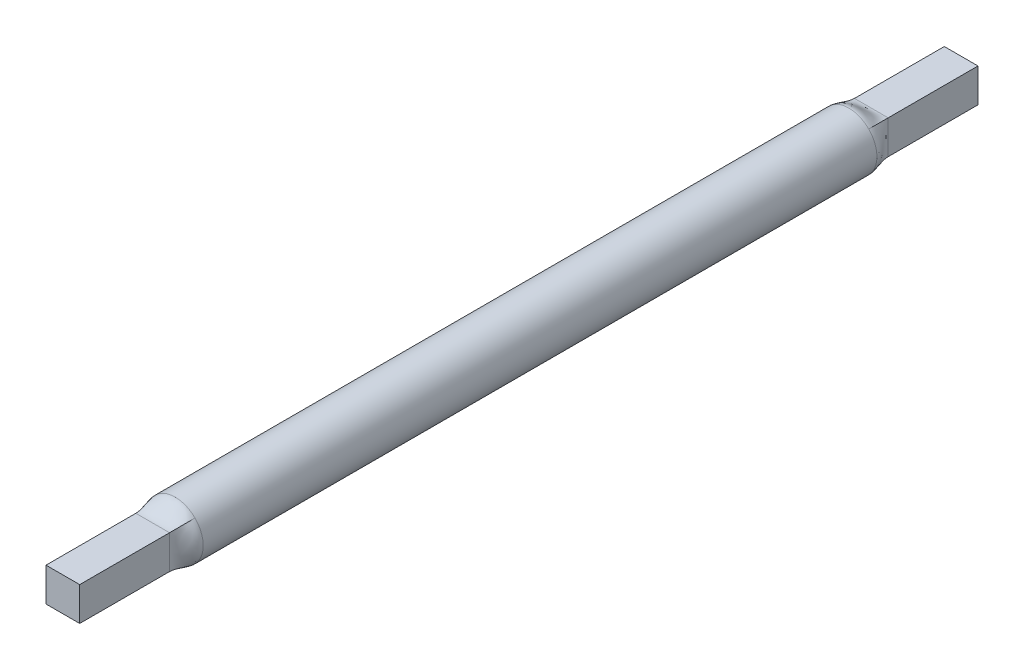
ISO-10303-21;
HEADER;
FILE_DESCRIPTION(('STEP AP214'),'2;1');
FILE_NAME('part.step','',(''),(''),'','','');
FILE_SCHEMA(('AUTOMOTIVE_DESIGN { 1 0 10303 214 1 1 1 1 }'));
ENDSEC;
DATA;
#1=APPLICATION_CONTEXT('core data for automotive mechanical design processes');
#2=APPLICATION_PROTOCOL_DEFINITION('international standard','automotive_design',2000,#1);
#3=PRODUCT_CONTEXT('',#1,'mechanical');
#4=PRODUCT('Part','Part','',(#3));
#5=PRODUCT_RELATED_PRODUCT_CATEGORY('part','',(#4));
#6=PRODUCT_DEFINITION_FORMATION('','',#4);
#7=PRODUCT_DEFINITION_CONTEXT('part definition',#1,'design');
#8=PRODUCT_DEFINITION('design','',#6,#7);
#9=PRODUCT_DEFINITION_SHAPE('','',#8);
#10=(LENGTH_UNIT() NAMED_UNIT(*) SI_UNIT(.MILLI.,.METRE.));
#11=(NAMED_UNIT(*) PLANE_ANGLE_UNIT() SI_UNIT($,.RADIAN.));
#12=(NAMED_UNIT(*) SI_UNIT($,.STERADIAN.) SOLID_ANGLE_UNIT());
#13=UNCERTAINTY_MEASURE_WITH_UNIT(LENGTH_MEASURE(1.E-05),#10,'distance_accuracy_value','');
#14=(GEOMETRIC_REPRESENTATION_CONTEXT(3) GLOBAL_UNCERTAINTY_ASSIGNED_CONTEXT((#13)) GLOBAL_UNIT_ASSIGNED_CONTEXT((#10,
#11,#12)) REPRESENTATION_CONTEXT('',''));
#15=CARTESIAN_POINT('',(0.,0.,0.));
#16=DIRECTION('',(0.,0.,1.));
#17=DIRECTION('',(1.,0.,0.));
#18=AXIS2_PLACEMENT_3D('',#15,#16,#17);
#19=CARTESIAN_POINT('',(0.,0.,-76.2));
#20=DIRECTION('',(0.,0.,1.));
#21=DIRECTION('',(1.,0.,0.));
#22=AXIS2_PLACEMENT_3D('',#19,#20,#21);
#23=CYLINDRICAL_SURFACE('',#22,6.35);
#24=CARTESIAN_POINT('',(-4.49012806053457,4.49012806053458,-76.2));
#25=CARTESIAN_POINT('',(-2.01195898744864,6.96829713362051,-76.2));
#26=CARTESIAN_POINT('',(2.01195898744864,6.96829713362051,-76.2));
#27=CARTESIAN_POINT('',(4.49012806053457,4.49012806053458,-76.2));
#28=B_SPLINE_CURVE_WITH_KNOTS('',3,(#24,#25,#26,#27),.UNSPECIFIED.,.F.,.F.,(4,4),(0.,1.),.UNSPECIFIED.);
#29=CARTESIAN_POINT('',(4.49012806053458,4.49012806053458,-76.2));
#30=VERTEX_POINT('',#29);
#31=CARTESIAN_POINT('',(-4.49012806053457,4.49012806053458,-76.2));
#32=VERTEX_POINT('',#31);
#33=EDGE_CURVE('E12',#30,#32,#28,.F.);
#34=ORIENTED_EDGE('',*,*,#33,.T.);
#35=CARTESIAN_POINT('',(0.,0.,-76.2));
#36=DIRECTION('',(0.,0.,1.));
#37=DIRECTION('',(1.,0.,0.));
#38=AXIS2_PLACEMENT_3D('',#35,#36,#37);
#39=CIRCLE('',#38,6.35);
#40=CARTESIAN_POINT('',(-4.49012806053458,-4.49012806053458,-76.2));
#41=VERTEX_POINT('',#40);
#42=EDGE_CURVE('E674',#32,#41,#39,.T.);
#43=ORIENTED_EDGE('',*,*,#42,.T.);
#44=CARTESIAN_POINT('',(4.49012806053458,-4.49012806053458,-76.2));
#45=VERTEX_POINT('',#44);
#46=EDGE_CURVE('E308',#41,#45,#39,.T.);
#47=ORIENTED_EDGE('',*,*,#46,.T.);
#48=EDGE_CURVE('E303',#45,#30,#39,.T.);
#49=ORIENTED_EDGE('',*,*,#48,.T.);
#50=EDGE_LOOP('',(#34,#43,#47,#49));
#51=FACE_BOUND('',#50,.T.);
#52=CARTESIAN_POINT('',(4.49012806053458,4.49012806053458,76.2));
#53=CARTESIAN_POINT('',(2.01195898744865,6.96829713362051,76.2));
#54=CARTESIAN_POINT('',(-2.01195898744864,6.96829713362051,76.2));
#55=CARTESIAN_POINT('',(-4.49012806053458,4.49012806053458,76.2));
#56=B_SPLINE_CURVE_WITH_KNOTS('',3,(#52,#53,#54,#55),.UNSPECIFIED.,.F.,.F.,(4,4),(0.,1.),.UNSPECIFIED.);
#57=CARTESIAN_POINT('',(4.49012806053458,4.49012806053458,76.2));
#58=VERTEX_POINT('',#57);
#59=CARTESIAN_POINT('',(-4.49012806053458,4.49012806053458,76.2));
#60=VERTEX_POINT('',#59);
#61=EDGE_CURVE('E190',#58,#60,#56,.T.);
#62=ORIENTED_EDGE('',*,*,#61,.F.);
#63=CARTESIAN_POINT('',(0.,0.,76.2));
#64=DIRECTION('',(0.,0.,1.));
#65=DIRECTION('',(1.,0.,0.));
#66=AXIS2_PLACEMENT_3D('',#63,#64,#65);
#67=CIRCLE('',#66,6.35);
#68=CARTESIAN_POINT('',(4.49012806053458,-4.49012806053458,76.2));
#69=VERTEX_POINT('',#68);
#70=EDGE_CURVE('E205',#69,#58,#67,.T.);
#71=ORIENTED_EDGE('',*,*,#70,.F.);
#72=CARTESIAN_POINT('',(-4.49012806053458,-4.49012806053458,76.2));
#73=VERTEX_POINT('',#72);
#74=EDGE_CURVE('E509',#73,#69,#67,.T.);
#75=ORIENTED_EDGE('',*,*,#74,.F.);
#76=EDGE_CURVE('E513',#60,#73,#67,.T.);
#77=ORIENTED_EDGE('',*,*,#76,.F.);
#78=EDGE_LOOP('',(#62,#71,#75,#77));
#79=FACE_BOUND('',#78,.T.);
#80=ADVANCED_FACE('F179',(#51,#79),#23,.T.);
#81=CARTESIAN_POINT('',(-3.81,-3.81,81.28));
#82=CARTESIAN_POINT('',(-3.81,-3.81,79.5565812929769));
#83=CARTESIAN_POINT('',(-4.49012806053458,-4.49012806053458,77.9234187070231));
#84=CARTESIAN_POINT('',(-4.49012806053458,-4.49012806053458,76.2));
#85=CARTESIAN_POINT('',(-3.81,-1.27,81.28));
#86=CARTESIAN_POINT('',(-3.81,-1.27,79.5565812929769));
#87=CARTESIAN_POINT('',(-6.96829713362051,-2.01195898744864,77.9234187070231));
#88=CARTESIAN_POINT('',(-6.96829713362051,-2.01195898744864,76.2));
#89=CARTESIAN_POINT('',(-3.81,1.27,81.28));
#90=CARTESIAN_POINT('',(-3.81,1.27,79.5565812929769));
#91=CARTESIAN_POINT('',(-6.96829713362051,2.01195898744865,77.9234187070231));
#92=CARTESIAN_POINT('',(-6.96829713362051,2.01195898744865,76.2));
#93=CARTESIAN_POINT('',(-3.81,3.81,81.28));
#94=CARTESIAN_POINT('',(-3.81,3.81,79.5565812929769));
#95=CARTESIAN_POINT('',(-4.49012806053458,4.49012806053458,77.9234187070231));
#96=CARTESIAN_POINT('',(-4.49012806053458,4.49012806053458,76.2));
#97=B_SPLINE_SURFACE_WITH_KNOTS('',3,3,((#81,#82,#83,#84),(#85,#86,#87,#88),(#89,#90,#91,#92),
(#93,#94,#95,#96)),.UNSPECIFIED.,.F.,.F.,.F.,(4,4),(4,4),(0.,1.),(0.,1.),.UNSPECIFIED.);
#98=DIRECTION('',(0.,-1.,0.));
#99=VECTOR('',#98,1.);
#100=CARTESIAN_POINT('',(-3.81,-3.81,81.28));
#101=LINE('',#100,#99);
#102=CARTESIAN_POINT('',(-3.81,3.81,81.28));
#103=VERTEX_POINT('',#102);
#104=CARTESIAN_POINT('',(-3.81,-3.81,81.28));
#105=VERTEX_POINT('',#104);
#106=EDGE_CURVE('E548',#103,#105,#101,.T.);
#107=CARTESIAN_POINT('',(-3.81,3.81,81.28));
#108=CARTESIAN_POINT('',(-3.81,3.81,79.5565812929769));
#109=CARTESIAN_POINT('',(-4.49012806053458,4.49012806053458,77.9234187070231));
#110=CARTESIAN_POINT('',(-4.49012806053458,4.49012806053458,76.2));
#111=B_SPLINE_CURVE_WITH_KNOTS('',3,(#107,#108,#109,#110),.UNSPECIFIED.,.F.,.F.,(4,4),(0.,1.),.UNSPECIFIED.);
#112=EDGE_CURVE('E539',#103,#60,#111,.T.);
#113=CARTESIAN_POINT('',(-3.81,-3.81,81.28));
#114=CARTESIAN_POINT('',(-3.81,-3.81,79.5565812929769));
#115=CARTESIAN_POINT('',(-4.49012806053458,-4.49012806053458,77.9234187070231));
#116=CARTESIAN_POINT('',(-4.49012806053458,-4.49012806053458,76.2));
#117=B_SPLINE_CURVE_WITH_KNOTS('',3,(#113,#114,#115,#116),.UNSPECIFIED.,.F.,.F.,(4,4),(0.,1.),.UNSPECIFIED.);
#118=EDGE_CURVE('E551',#73,#105,#117,.F.);
#119=ORIENTED_EDGE('',*,*,#106,.F.);
#120=ORIENTED_EDGE('',*,*,#112,.T.);
#121=ORIENTED_EDGE('',*,*,#76,.T.);
#122=ORIENTED_EDGE('',*,*,#118,.T.);
#123=EDGE_LOOP('',(#119,#120,#121,#122));
#124=FACE_BOUND('',#123,.T.);
#125=ADVANCED_FACE('F546',(#124),#97,.T.);
#126=CARTESIAN_POINT('',(-3.81,3.81,81.28));
#127=CARTESIAN_POINT('',(-3.81,3.81,79.5565812929769));
#128=CARTESIAN_POINT('',(-4.49012806053458,4.49012806053458,77.9234187070231));
#129=CARTESIAN_POINT('',(-4.49012806053458,4.49012806053458,76.2));
#130=CARTESIAN_POINT('',(-1.27,3.81,81.28));
#131=CARTESIAN_POINT('',(-1.27,3.81,79.5565812929769));
#132=CARTESIAN_POINT('',(-2.01195898744864,6.96829713362051,77.9234187070231));
#133=CARTESIAN_POINT('',(-2.01195898744864,6.96829713362051,76.2));
#134=CARTESIAN_POINT('',(1.27,3.81,81.28));
#135=CARTESIAN_POINT('',(1.27,3.81,79.5565812929769));
#136=CARTESIAN_POINT('',(2.01195898744865,6.96829713362051,77.9234187070231));
#137=CARTESIAN_POINT('',(2.01195898744865,6.96829713362051,76.2));
#138=CARTESIAN_POINT('',(3.81,3.81,81.28));
#139=CARTESIAN_POINT('',(3.81,3.81,79.5565812929769));
#140=CARTESIAN_POINT('',(4.49012806053458,4.49012806053458,77.9234187070231));
#141=CARTESIAN_POINT('',(4.49012806053458,4.49012806053458,76.2));
#142=B_SPLINE_SURFACE_WITH_KNOTS('',3,3,((#126,#127,#128,#129),(#130,#131,#132,#133),(#134,#135,
#136,#137),(#138,#139,#140,#141)),.UNSPECIFIED.,.F.,.F.,.F.,(4,4),(4,4),(0.,1.),(0.,1.),.UNSPECIFIED.);
#143=DIRECTION('',(-1.,0.,0.));
#144=VECTOR('',#143,1.);
#145=CARTESIAN_POINT('',(-3.81,3.81,81.28));
#146=LINE('',#145,#144);
#147=CARTESIAN_POINT('',(3.81,3.81,81.28));
#148=VERTEX_POINT('',#147);
#149=EDGE_CURVE('E570',#148,#103,#146,.T.);
#150=CARTESIAN_POINT('',(3.81,3.81,81.28));
#151=CARTESIAN_POINT('',(3.81,3.81,79.5565812929769));
#152=CARTESIAN_POINT('',(4.49012806053458,4.49012806053458,77.9234187070231));
#153=CARTESIAN_POINT('',(4.49012806053458,4.49012806053458,76.2));
#154=B_SPLINE_CURVE_WITH_KNOTS('',3,(#150,#151,#152,#153),.UNSPECIFIED.,.F.,.F.,(4,4),(0.,1.),.UNSPECIFIED.);
#155=EDGE_CURVE('E542',#148,#58,#154,.T.);
#156=ORIENTED_EDGE('',*,*,#149,.F.);
#157=ORIENTED_EDGE('',*,*,#155,.T.);
#158=ORIENTED_EDGE('',*,*,#61,.T.);
#159=ORIENTED_EDGE('',*,*,#112,.F.);
#160=EDGE_LOOP('',(#156,#157,#158,#159));
#161=FACE_BOUND('',#160,.T.);
#162=ADVANCED_FACE('F477',(#161),#142,.T.);
#163=CARTESIAN_POINT('',(3.81,-3.81,81.28));
#164=CARTESIAN_POINT('',(3.81,-3.81,79.5565812929769));
#165=CARTESIAN_POINT('',(4.49012806053458,-4.49012806053458,77.9234187070231));
#166=CARTESIAN_POINT('',(4.49012806053458,-4.49012806053458,76.2));
#167=CARTESIAN_POINT('',(1.27,-3.81,81.28));
#168=CARTESIAN_POINT('',(1.27,-3.81,79.5565812929769));
#169=CARTESIAN_POINT('',(2.01195898744864,-6.96829713362051,77.9234187070231));
#170=CARTESIAN_POINT('',(2.01195898744864,-6.96829713362051,76.2));
#171=CARTESIAN_POINT('',(-1.27,-3.81,81.28));
#172=CARTESIAN_POINT('',(-1.27,-3.81,79.5565812929769));
#173=CARTESIAN_POINT('',(-2.01195898744865,-6.96829713362051,77.9234187070231));
#174=CARTESIAN_POINT('',(-2.01195898744865,-6.96829713362051,76.2));
#175=CARTESIAN_POINT('',(-3.81,-3.81,81.28));
#176=CARTESIAN_POINT('',(-3.81,-3.81,79.5565812929769));
#177=CARTESIAN_POINT('',(-4.49012806053458,-4.49012806053458,77.9234187070231));
#178=CARTESIAN_POINT('',(-4.49012806053458,-4.49012806053458,76.2));
#179=B_SPLINE_SURFACE_WITH_KNOTS('',3,3,((#163,#164,#165,#166),(#167,#168,#169,#170),(#171,#172,
#173,#174),(#175,#176,#177,#178)),.UNSPECIFIED.,.F.,.F.,.F.,(4,4),(4,4),(0.,1.),(0.,1.),.UNSPECIFIED.);
#180=DIRECTION('',(1.,0.,0.));
#181=VECTOR('',#180,1.);
#182=CARTESIAN_POINT('',(-3.81,-3.81,81.28));
#183=LINE('',#182,#181);
#184=CARTESIAN_POINT('',(3.81,-3.81,81.28));
#185=VERTEX_POINT('',#184);
#186=EDGE_CURVE('E457',#105,#185,#183,.T.);
#187=CARTESIAN_POINT('',(3.81,-3.81,81.28));
#188=CARTESIAN_POINT('',(3.81,-3.81,79.5565812929769));
#189=CARTESIAN_POINT('',(4.49012806053458,-4.49012806053458,77.9234187070231));
#190=CARTESIAN_POINT('',(4.49012806053458,-4.49012806053458,76.2));
#191=B_SPLINE_CURVE_WITH_KNOTS('',3,(#187,#188,#189,#190),.UNSPECIFIED.,.F.,.F.,(4,4),(0.,1.),.UNSPECIFIED.);
#192=EDGE_CURVE('E463',#185,#69,#191,.T.);
#193=ORIENTED_EDGE('',*,*,#186,.F.);
#194=ORIENTED_EDGE('',*,*,#118,.F.);
#195=ORIENTED_EDGE('',*,*,#74,.T.);
#196=ORIENTED_EDGE('',*,*,#192,.F.);
#197=EDGE_LOOP('',(#193,#194,#195,#196));
#198=FACE_BOUND('',#197,.T.);
#199=ADVANCED_FACE('F465',(#198),#179,.T.);
#200=CARTESIAN_POINT('',(3.81,3.81,81.28));
#201=CARTESIAN_POINT('',(3.81,3.81,79.5565812929769));
#202=CARTESIAN_POINT('',(4.49012806053458,4.49012806053458,77.9234187070231));
#203=CARTESIAN_POINT('',(4.49012806053458,4.49012806053458,76.2));
#204=CARTESIAN_POINT('',(3.81,1.27,81.28));
#205=CARTESIAN_POINT('',(3.81,1.27,79.5565812929769));
#206=CARTESIAN_POINT('',(6.96829713362051,2.01195898744864,77.9234187070231));
#207=CARTESIAN_POINT('',(6.96829713362051,2.01195898744864,76.2));
#208=CARTESIAN_POINT('',(3.81,-1.27,81.28));
#209=CARTESIAN_POINT('',(3.81,-1.27,79.5565812929769));
#210=CARTESIAN_POINT('',(6.96829713362051,-2.01195898744865,77.9234187070231));
#211=CARTESIAN_POINT('',(6.96829713362051,-2.01195898744865,76.2));
#212=CARTESIAN_POINT('',(3.81,-3.81,81.28));
#213=CARTESIAN_POINT('',(3.81,-3.81,79.5565812929769));
#214=CARTESIAN_POINT('',(4.49012806053458,-4.49012806053458,77.9234187070231));
#215=CARTESIAN_POINT('',(4.49012806053458,-4.49012806053458,76.2));
#216=B_SPLINE_SURFACE_WITH_KNOTS('',3,3,((#200,#201,#202,#203),(#204,#205,#206,#207),(#208,#209,
#210,#211),(#212,#213,#214,#215)),.UNSPECIFIED.,.F.,.F.,.F.,(4,4),(4,4),(0.,1.),(0.,1.),.UNSPECIFIED.);
#217=DIRECTION('',(0.,1.,0.));
#218=VECTOR('',#217,1.);
#219=CARTESIAN_POINT('',(3.81,-3.81,81.28));
#220=LINE('',#219,#218);
#221=EDGE_CURVE('E591',#185,#148,#220,.T.);
#222=ORIENTED_EDGE('',*,*,#221,.F.);
#223=ORIENTED_EDGE('',*,*,#192,.T.);
#224=ORIENTED_EDGE('',*,*,#70,.T.);
#225=ORIENTED_EDGE('',*,*,#155,.F.);
#226=EDGE_LOOP('',(#222,#223,#224,#225));
#227=FACE_BOUND('',#226,.T.);
#228=ADVANCED_FACE('F476',(#227),#216,.T.);
#229=CARTESIAN_POINT('',(3.81,-3.81,81.28));
#230=DIRECTION('',(1.,0.,0.));
#231=DIRECTION('',(0.,0.,-1.));
#232=AXIS2_PLACEMENT_3D('',#229,#230,#231);
#233=PLANE('',#232);
#234=DIRECTION('',(0.,1.,0.));
#235=VECTOR('',#234,1.);
#236=CARTESIAN_POINT('',(3.81,-3.81,101.6));
#237=LINE('',#236,#235);
#238=CARTESIAN_POINT('',(3.81,-3.81,101.6));
#239=VERTEX_POINT('',#238);
#240=CARTESIAN_POINT('',(3.81,3.81,101.6));
#241=VERTEX_POINT('',#240);
#242=EDGE_CURVE('E435',#239,#241,#237,.T.);
#243=ORIENTED_EDGE('',*,*,#242,.F.);
#244=DIRECTION('',(0.,0.,1.));
#245=VECTOR('',#244,1.);
#246=CARTESIAN_POINT('',(3.81,-3.81,81.28));
#247=LINE('',#246,#245);
#248=EDGE_CURVE('E622',#185,#239,#247,.T.);
#249=ORIENTED_EDGE('',*,*,#248,.F.);
#250=ORIENTED_EDGE('',*,*,#221,.T.);
#251=DIRECTION('',(0.,0.,1.));
#252=VECTOR('',#251,1.);
#253=CARTESIAN_POINT('',(3.81,3.81,81.28));
#254=LINE('',#253,#252);
#255=EDGE_CURVE('E451',#148,#241,#254,.T.);
#256=ORIENTED_EDGE('',*,*,#255,.T.);
#257=EDGE_LOOP('',(#243,#249,#250,#256));
#258=FACE_BOUND('',#257,.T.);
#259=ADVANCED_FACE('F621',(#258),#233,.T.);
#260=CARTESIAN_POINT('',(-3.81,-3.81,81.28));
#261=DIRECTION('',(0.,-1.,0.));
#262=DIRECTION('',(0.,0.,-1.));
#263=AXIS2_PLACEMENT_3D('',#260,#261,#262);
#264=PLANE('',#263);
#265=DIRECTION('',(1.,0.,0.));
#266=VECTOR('',#265,1.);
#267=CARTESIAN_POINT('',(-3.81,-3.81,101.6));
#268=LINE('',#267,#266);
#269=CARTESIAN_POINT('',(-3.81,-3.81,101.6));
#270=VERTEX_POINT('',#269);
#271=EDGE_CURVE('E447',#270,#239,#268,.T.);
#272=ORIENTED_EDGE('',*,*,#271,.F.);
#273=DIRECTION('',(0.,0.,1.));
#274=VECTOR('',#273,1.);
#275=CARTESIAN_POINT('',(-3.81,-3.81,81.28));
#276=LINE('',#275,#274);
#277=EDGE_CURVE('E896',#105,#270,#276,.T.);
#278=ORIENTED_EDGE('',*,*,#277,.F.);
#279=ORIENTED_EDGE('',*,*,#186,.T.);
#280=ORIENTED_EDGE('',*,*,#248,.T.);
#281=EDGE_LOOP('',(#272,#278,#279,#280));
#282=FACE_BOUND('',#281,.T.);
#283=ADVANCED_FACE('F641',(#282),#264,.T.);
#284=CARTESIAN_POINT('',(-3.81,-3.81,81.28));
#285=DIRECTION('',(-1.,0.,0.));
#286=DIRECTION('',(0.,0.,1.));
#287=AXIS2_PLACEMENT_3D('',#284,#285,#286);
#288=PLANE('',#287);
#289=DIRECTION('',(0.,-1.,0.));
#290=VECTOR('',#289,1.);
#291=CARTESIAN_POINT('',(-3.81,-3.81,101.6));
#292=LINE('',#291,#290);
#293=CARTESIAN_POINT('',(-3.81,3.81,101.6));
#294=VERTEX_POINT('',#293);
#295=EDGE_CURVE('E443',#294,#270,#292,.T.);
#296=ORIENTED_EDGE('',*,*,#295,.F.);
#297=DIRECTION('',(0.,0.,1.));
#298=VECTOR('',#297,1.);
#299=CARTESIAN_POINT('',(-3.81,3.81,81.28));
#300=LINE('',#299,#298);
#301=EDGE_CURVE('E618',#103,#294,#300,.T.);
#302=ORIENTED_EDGE('',*,*,#301,.F.);
#303=ORIENTED_EDGE('',*,*,#106,.T.);
#304=ORIENTED_EDGE('',*,*,#277,.T.);
#305=EDGE_LOOP('',(#296,#302,#303,#304));
#306=FACE_BOUND('',#305,.T.);
#307=ADVANCED_FACE('F843',(#306),#288,.T.);
#308=CARTESIAN_POINT('',(-3.81,3.81,81.28));
#309=DIRECTION('',(0.,1.,0.));
#310=DIRECTION('',(0.,0.,1.));
#311=AXIS2_PLACEMENT_3D('',#308,#309,#310);
#312=PLANE('',#311);
#313=DIRECTION('',(-1.,0.,0.));
#314=VECTOR('',#313,1.);
#315=CARTESIAN_POINT('',(-3.81,3.81,101.6));
#316=LINE('',#315,#314);
#317=EDGE_CURVE('E439',#241,#294,#316,.T.);
#318=ORIENTED_EDGE('',*,*,#317,.F.);
#319=ORIENTED_EDGE('',*,*,#255,.F.);
#320=ORIENTED_EDGE('',*,*,#149,.T.);
#321=ORIENTED_EDGE('',*,*,#301,.T.);
#322=EDGE_LOOP('',(#318,#319,#320,#321));
#323=FACE_BOUND('',#322,.T.);
#324=ADVANCED_FACE('F613',(#323),#312,.T.);
#325=CARTESIAN_POINT('',(0.,0.,101.6));
#326=DIRECTION('',(0.,0.,-1.));
#327=DIRECTION('',(-1.,0.,0.));
#328=AXIS2_PLACEMENT_3D('',#325,#326,#327);
#329=PLANE('',#328);
#330=ORIENTED_EDGE('',*,*,#242,.T.);
#331=ORIENTED_EDGE('',*,*,#317,.T.);
#332=ORIENTED_EDGE('',*,*,#295,.T.);
#333=ORIENTED_EDGE('',*,*,#271,.T.);
#334=EDGE_LOOP('',(#330,#331,#332,#333));
#335=FACE_BOUND('',#334,.T.);
#336=ADVANCED_FACE('F341',(#335),#329,.F.);
#337=CARTESIAN_POINT('',(3.81,3.81,-81.28));
#338=CARTESIAN_POINT('',(3.81,3.81,-79.5565812929769));
#339=CARTESIAN_POINT('',(4.49012806053457,4.49012806053458,-77.9234187070231));
#340=CARTESIAN_POINT('',(4.49012806053457,4.49012806053458,-76.2));
#341=CARTESIAN_POINT('',(1.27,3.81,-81.28));
#342=CARTESIAN_POINT('',(1.27,3.81,-79.5565812929769));
#343=CARTESIAN_POINT('',(2.01195898744864,6.96829713362051,-77.9234187070231));
#344=CARTESIAN_POINT('',(2.01195898744864,6.96829713362051,-76.2));
#345=CARTESIAN_POINT('',(-1.27,3.81,-81.28));
#346=CARTESIAN_POINT('',(-1.27,3.81,-79.5565812929769));
#347=CARTESIAN_POINT('',(-2.01195898744864,6.96829713362051,-77.9234187070231));
#348=CARTESIAN_POINT('',(-2.01195898744864,6.96829713362051,-76.2));
#349=CARTESIAN_POINT('',(-3.81,3.81,-81.28));
#350=CARTESIAN_POINT('',(-3.81,3.81,-79.5565812929769));
#351=CARTESIAN_POINT('',(-4.49012806053457,4.49012806053458,-77.9234187070231));
#352=CARTESIAN_POINT('',(-4.49012806053457,4.49012806053458,-76.2));
#353=B_SPLINE_SURFACE_WITH_KNOTS('',3,3,((#337,#338,#339,#340),(#341,#342,#343,#344),(#345,#346,
#347,#348),(#349,#350,#351,#352)),.UNSPECIFIED.,.F.,.F.,.F.,(4,4),(4,4),(0.,1.),(0.,1.),.UNSPECIFIED.);
#354=DIRECTION('',(-1.,0.,0.));
#355=VECTOR('',#354,1.);
#356=CARTESIAN_POINT('',(-3.81,3.81,-81.28));
#357=LINE('',#356,#355);
#358=CARTESIAN_POINT('',(3.81,3.81,-81.28));
#359=VERTEX_POINT('',#358);
#360=CARTESIAN_POINT('',(-3.81,3.81,-81.28));
#361=VERTEX_POINT('',#360);
#362=EDGE_CURVE('E285',#359,#361,#357,.T.);
#363=CARTESIAN_POINT('',(-3.81,3.81,-81.28));
#364=CARTESIAN_POINT('',(-3.81,3.81,-79.5565812929769));
#365=CARTESIAN_POINT('',(-4.49012806053457,4.49012806053458,-77.9234187070231));
#366=CARTESIAN_POINT('',(-4.49012806053457,4.49012806053458,-76.2));
#367=B_SPLINE_CURVE_WITH_KNOTS('',3,(#363,#364,#365,#366),.UNSPECIFIED.,.F.,.F.,(4,4),(0.,1.),.UNSPECIFIED.);
#368=EDGE_CURVE('E397',#361,#32,#367,.T.);
#369=CARTESIAN_POINT('',(3.81,3.81,-81.28));
#370=CARTESIAN_POINT('',(3.81,3.81,-79.5565812929769));
#371=CARTESIAN_POINT('',(4.49012806053457,4.49012806053458,-77.9234187070231));
#372=CARTESIAN_POINT('',(4.49012806053457,4.49012806053458,-76.2));
#373=B_SPLINE_CURVE_WITH_KNOTS('',3,(#369,#370,#371,#372),.UNSPECIFIED.,.F.,.F.,(4,4),(0.,1.),.UNSPECIFIED.);
#374=EDGE_CURVE('E197',#30,#359,#373,.F.);
#375=ORIENTED_EDGE('',*,*,#362,.T.);
#376=ORIENTED_EDGE('',*,*,#368,.T.);
#377=ORIENTED_EDGE('',*,*,#33,.F.);
#378=ORIENTED_EDGE('',*,*,#374,.T.);
#379=EDGE_LOOP('',(#375,#376,#377,#378));
#380=FACE_BOUND('',#379,.T.);
#381=ADVANCED_FACE('F367',(#380),#353,.T.);
#382=CARTESIAN_POINT('',(-3.81,3.81,-81.28));
#383=CARTESIAN_POINT('',(-3.81,3.81,-79.5565812929769));
#384=CARTESIAN_POINT('',(-4.49012806053457,4.49012806053458,-77.9234187070231));
#385=CARTESIAN_POINT('',(-4.49012806053457,4.49012806053458,-76.2));
#386=CARTESIAN_POINT('',(-3.81,1.27,-81.28));
#387=CARTESIAN_POINT('',(-3.81,1.27,-79.5565812929769));
#388=CARTESIAN_POINT('',(-6.96829713362051,2.01195898744865,-77.9234187070231));
#389=CARTESIAN_POINT('',(-6.96829713362051,2.01195898744865,-76.2));
#390=CARTESIAN_POINT('',(-3.81,-1.27,-81.28));
#391=CARTESIAN_POINT('',(-3.81,-1.27,-79.5565812929769));
#392=CARTESIAN_POINT('',(-6.96829713362051,-2.01195898744864,-77.9234187070231));
#393=CARTESIAN_POINT('',(-6.96829713362051,-2.01195898744864,-76.2));
#394=CARTESIAN_POINT('',(-3.81,-3.81,-81.28));
#395=CARTESIAN_POINT('',(-3.81,-3.81,-79.5565812929769));
#396=CARTESIAN_POINT('',(-4.49012806053458,-4.49012806053458,-77.9234187070231));
#397=CARTESIAN_POINT('',(-4.49012806053458,-4.49012806053458,-76.2));
#398=B_SPLINE_SURFACE_WITH_KNOTS('',3,3,((#382,#383,#384,#385),(#386,#387,#388,#389),(#390,#391,
#392,#393),(#394,#395,#396,#397)),.UNSPECIFIED.,.F.,.F.,.F.,(4,4),(4,4),(0.,1.),(0.,1.),.UNSPECIFIED.);
#399=DIRECTION('',(0.,-1.,0.));
#400=VECTOR('',#399,1.);
#401=CARTESIAN_POINT('',(-3.81,-3.81,-81.28));
#402=LINE('',#401,#400);
#403=CARTESIAN_POINT('',(-3.81,-3.81,-81.28));
#404=VERTEX_POINT('',#403);
#405=EDGE_CURVE('E183',#361,#404,#402,.T.);
#406=CARTESIAN_POINT('',(-3.81,-3.81,-81.28));
#407=CARTESIAN_POINT('',(-3.81,-3.81,-79.5565812929769));
#408=CARTESIAN_POINT('',(-4.49012806053458,-4.49012806053458,-77.9234187070231));
#409=CARTESIAN_POINT('',(-4.49012806053458,-4.49012806053458,-76.2));
#410=B_SPLINE_CURVE_WITH_KNOTS('',3,(#406,#407,#408,#409),.UNSPECIFIED.,.F.,.F.,(4,4),(0.,1.),.UNSPECIFIED.);
#411=EDGE_CURVE('E309',#404,#41,#410,.T.);
#412=ORIENTED_EDGE('',*,*,#405,.T.);
#413=ORIENTED_EDGE('',*,*,#411,.T.);
#414=ORIENTED_EDGE('',*,*,#42,.F.);
#415=ORIENTED_EDGE('',*,*,#368,.F.);
#416=EDGE_LOOP('',(#412,#413,#414,#415));
#417=FACE_BOUND('',#416,.T.);
#418=ADVANCED_FACE('F378',(#417),#398,.T.);
#419=CARTESIAN_POINT('',(3.81,-3.81,-81.28));
#420=CARTESIAN_POINT('',(3.81,-3.81,-79.5565812929769));
#421=CARTESIAN_POINT('',(4.49012806053458,-4.49012806053458,-77.9234187070231));
#422=CARTESIAN_POINT('',(4.49012806053458,-4.49012806053458,-76.2));
#423=CARTESIAN_POINT('',(3.81,-1.27,-81.28));
#424=CARTESIAN_POINT('',(3.81,-1.27,-79.5565812929769));
#425=CARTESIAN_POINT('',(6.96829713362051,-2.01195898744865,-77.9234187070231));
#426=CARTESIAN_POINT('',(6.96829713362051,-2.01195898744865,-76.2));
#427=CARTESIAN_POINT('',(3.81,1.27,-81.28));
#428=CARTESIAN_POINT('',(3.81,1.27,-79.5565812929769));
#429=CARTESIAN_POINT('',(6.96829713362051,2.01195898744865,-77.9234187070231));
#430=CARTESIAN_POINT('',(6.96829713362051,2.01195898744865,-76.2));
#431=CARTESIAN_POINT('',(3.81,3.81,-81.28));
#432=CARTESIAN_POINT('',(3.81,3.81,-79.5565812929769));
#433=CARTESIAN_POINT('',(4.49012806053457,4.49012806053458,-77.9234187070231));
#434=CARTESIAN_POINT('',(4.49012806053457,4.49012806053458,-76.2));
#435=B_SPLINE_SURFACE_WITH_KNOTS('',3,3,((#419,#420,#421,#422),(#423,#424,#425,#426),(#427,#428,
#429,#430),(#431,#432,#433,#434)),.UNSPECIFIED.,.F.,.F.,.F.,(4,4),(4,4),(0.,1.),(0.,1.),.UNSPECIFIED.);
#436=DIRECTION('',(0.,1.,0.));
#437=VECTOR('',#436,1.);
#438=CARTESIAN_POINT('',(3.81,-3.81,-81.28));
#439=LINE('',#438,#437);
#440=CARTESIAN_POINT('',(3.81,-3.81,-81.28));
#441=VERTEX_POINT('',#440);
#442=EDGE_CURVE('E273',#441,#359,#439,.T.);
#443=CARTESIAN_POINT('',(3.81,-3.81,-81.28));
#444=CARTESIAN_POINT('',(3.81,-3.81,-79.5565812929769));
#445=CARTESIAN_POINT('',(4.49012806053458,-4.49012806053458,-77.9234187070231));
#446=CARTESIAN_POINT('',(4.49012806053458,-4.49012806053458,-76.2));
#447=B_SPLINE_CURVE_WITH_KNOTS('',3,(#443,#444,#445,#446),.UNSPECIFIED.,.F.,.F.,(4,4),(0.,1.),.UNSPECIFIED.);
#448=EDGE_CURVE('E300',#441,#45,#447,.T.);
#449=ORIENTED_EDGE('',*,*,#442,.T.);
#450=ORIENTED_EDGE('',*,*,#374,.F.);
#451=ORIENTED_EDGE('',*,*,#48,.F.);
#452=ORIENTED_EDGE('',*,*,#448,.F.);
#453=EDGE_LOOP('',(#449,#450,#451,#452));
#454=FACE_BOUND('',#453,.T.);
#455=ADVANCED_FACE('F301',(#454),#435,.T.);
#456=CARTESIAN_POINT('',(-3.81,-3.81,-81.28));
#457=CARTESIAN_POINT('',(-3.81,-3.81,-79.5565812929769));
#458=CARTESIAN_POINT('',(-4.49012806053458,-4.49012806053458,-77.9234187070231));
#459=CARTESIAN_POINT('',(-4.49012806053458,-4.49012806053458,-76.2));
#460=CARTESIAN_POINT('',(-1.27,-3.81,-81.28));
#461=CARTESIAN_POINT('',(-1.27,-3.81,-79.5565812929769));
#462=CARTESIAN_POINT('',(-2.01195898744865,-6.96829713362051,-77.9234187070231));
#463=CARTESIAN_POINT('',(-2.01195898744865,-6.96829713362051,-76.2));
#464=CARTESIAN_POINT('',(1.27,-3.81,-81.28));
#465=CARTESIAN_POINT('',(1.27,-3.81,-79.5565812929769));
#466=CARTESIAN_POINT('',(2.01195898744864,-6.96829713362051,-77.9234187070231));
#467=CARTESIAN_POINT('',(2.01195898744864,-6.96829713362051,-76.2));
#468=CARTESIAN_POINT('',(3.81,-3.81,-81.28));
#469=CARTESIAN_POINT('',(3.81,-3.81,-79.5565812929769));
#470=CARTESIAN_POINT('',(4.49012806053458,-4.49012806053458,-77.9234187070231));
#471=CARTESIAN_POINT('',(4.49012806053458,-4.49012806053458,-76.2));
#472=B_SPLINE_SURFACE_WITH_KNOTS('',3,3,((#456,#457,#458,#459),(#460,#461,#462,#463),(#464,#465,
#466,#467),(#468,#469,#470,#471)),.UNSPECIFIED.,.F.,.F.,.F.,(4,4),(4,4),(0.,1.),(0.,1.),.UNSPECIFIED.);
#473=DIRECTION('',(1.,0.,0.));
#474=VECTOR('',#473,1.);
#475=CARTESIAN_POINT('',(-3.81,-3.81,-81.28));
#476=LINE('',#475,#474);
#477=EDGE_CURVE('E293',#404,#441,#476,.T.);
#478=ORIENTED_EDGE('',*,*,#477,.T.);
#479=ORIENTED_EDGE('',*,*,#448,.T.);
#480=ORIENTED_EDGE('',*,*,#46,.F.);
#481=ORIENTED_EDGE('',*,*,#411,.F.);
#482=EDGE_LOOP('',(#478,#479,#480,#481));
#483=FACE_BOUND('',#482,.T.);
#484=ADVANCED_FACE('F313',(#483),#472,.T.);
#485=CARTESIAN_POINT('',(-3.81,-3.81,-81.28));
#486=DIRECTION('',(0.,1.,0.));
#487=DIRECTION('',(0.,0.,1.));
#488=AXIS2_PLACEMENT_3D('',#485,#486,#487);
#489=PLANE('',#488);
#490=DIRECTION('',(1.,0.,0.));
#491=VECTOR('',#490,1.);
#492=CARTESIAN_POINT('',(-3.81,-3.81,-101.6));
#493=LINE('',#492,#491);
#494=CARTESIAN_POINT('',(-3.81,-3.81,-101.6));
#495=VERTEX_POINT('',#494);
#496=CARTESIAN_POINT('',(3.81,-3.81,-101.6));
#497=VERTEX_POINT('',#496);
#498=EDGE_CURVE('E297',#495,#497,#493,.T.);
#499=ORIENTED_EDGE('',*,*,#498,.T.);
#500=DIRECTION('',(0.,0.,-1.));
#501=VECTOR('',#500,1.);
#502=CARTESIAN_POINT('',(3.81,-3.81,-81.28));
#503=LINE('',#502,#501);
#504=EDGE_CURVE('E278',#441,#497,#503,.T.);
#505=ORIENTED_EDGE('',*,*,#504,.F.);
#506=ORIENTED_EDGE('',*,*,#477,.F.);
#507=DIRECTION('',(0.,0.,-1.));
#508=VECTOR('',#507,1.);
#509=CARTESIAN_POINT('',(-3.81,-3.81,-81.28));
#510=LINE('',#509,#508);
#511=EDGE_CURVE('E708',#404,#495,#510,.T.);
#512=ORIENTED_EDGE('',*,*,#511,.T.);
#513=EDGE_LOOP('',(#499,#505,#506,#512));
#514=FACE_BOUND('',#513,.T.);
#515=ADVANCED_FACE('F291',(#514),#489,.F.);
#516=CARTESIAN_POINT('',(3.81,-3.81,-81.28));
#517=DIRECTION('',(-1.,0.,0.));
#518=DIRECTION('',(0.,0.,1.));
#519=AXIS2_PLACEMENT_3D('',#516,#517,#518);
#520=PLANE('',#519);
#521=DIRECTION('',(0.,1.,0.));
#522=VECTOR('',#521,1.);
#523=CARTESIAN_POINT('',(3.81,-3.81,-101.6));
#524=LINE('',#523,#522);
#525=CARTESIAN_POINT('',(3.81,3.81,-101.6));
#526=VERTEX_POINT('',#525);
#527=EDGE_CURVE('E765',#497,#526,#524,.T.);
#528=ORIENTED_EDGE('',*,*,#527,.T.);
#529=DIRECTION('',(0.,0.,-1.));
#530=VECTOR('',#529,1.);
#531=CARTESIAN_POINT('',(3.81,3.81,-81.28));
#532=LINE('',#531,#530);
#533=EDGE_CURVE('E280',#359,#526,#532,.T.);
#534=ORIENTED_EDGE('',*,*,#533,.F.);
#535=ORIENTED_EDGE('',*,*,#442,.F.);
#536=ORIENTED_EDGE('',*,*,#504,.T.);
#537=EDGE_LOOP('',(#528,#534,#535,#536));
#538=FACE_BOUND('',#537,.T.);
#539=ADVANCED_FACE('F277',(#538),#520,.F.);
#540=CARTESIAN_POINT('',(-3.81,3.81,-81.28));
#541=DIRECTION('',(0.,1.,0.));
#542=DIRECTION('',(0.,0.,1.));
#543=AXIS2_PLACEMENT_3D('',#540,#541,#542);
#544=PLANE('',#543);
#545=DIRECTION('',(1.,0.,0.));
#546=VECTOR('',#545,1.);
#547=CARTESIAN_POINT('',(-3.81,3.81,-101.6));
#548=LINE('',#547,#546);
#549=CARTESIAN_POINT('',(-3.81,3.81,-101.6));
#550=VERTEX_POINT('',#549);
#551=EDGE_CURVE('E760',#550,#526,#548,.T.);
#552=ORIENTED_EDGE('',*,*,#551,.F.);
#553=DIRECTION('',(0.,0.,-1.));
#554=VECTOR('',#553,1.);
#555=CARTESIAN_POINT('',(-3.81,3.81,-81.28));
#556=LINE('',#555,#554);
#557=EDGE_CURVE('E705',#361,#550,#556,.T.);
#558=ORIENTED_EDGE('',*,*,#557,.F.);
#559=ORIENTED_EDGE('',*,*,#362,.F.);
#560=ORIENTED_EDGE('',*,*,#533,.T.);
#561=EDGE_LOOP('',(#552,#558,#559,#560));
#562=FACE_BOUND('',#561,.T.);
#563=ADVANCED_FACE('F716',(#562),#544,.T.);
#564=CARTESIAN_POINT('',(-3.81,-3.81,-81.28));
#565=DIRECTION('',(-1.,0.,0.));
#566=DIRECTION('',(0.,0.,1.));
#567=AXIS2_PLACEMENT_3D('',#564,#565,#566);
#568=PLANE('',#567);
#569=DIRECTION('',(0.,1.,0.));
#570=VECTOR('',#569,1.);
#571=CARTESIAN_POINT('',(-3.81,-3.81,-101.6));
#572=LINE('',#571,#570);
#573=EDGE_CURVE('E319',#495,#550,#572,.T.);
#574=ORIENTED_EDGE('',*,*,#573,.F.);
#575=ORIENTED_EDGE('',*,*,#511,.F.);
#576=ORIENTED_EDGE('',*,*,#405,.F.);
#577=ORIENTED_EDGE('',*,*,#557,.T.);
#578=EDGE_LOOP('',(#574,#575,#576,#577));
#579=FACE_BOUND('',#578,.T.);
#580=ADVANCED_FACE('F725',(#579),#568,.T.);
#581=CARTESIAN_POINT('',(0.,0.,-101.6));
#582=DIRECTION('',(0.,0.,1.));
#583=DIRECTION('',(1.,0.,0.));
#584=AXIS2_PLACEMENT_3D('',#581,#582,#583);
#585=PLANE('',#584);
#586=ORIENTED_EDGE('',*,*,#498,.F.);
#587=ORIENTED_EDGE('',*,*,#573,.T.);
#588=ORIENTED_EDGE('',*,*,#551,.T.);
#589=ORIENTED_EDGE('',*,*,#527,.F.);
#590=EDGE_LOOP('',(#586,#587,#588,#589));
#591=FACE_BOUND('',#590,.T.);
#592=ADVANCED_FACE('F771',(#591),#585,.F.);
#593=CLOSED_SHELL('',(#80,#125,#162,#199,#228,#259,#283,#307,#324,#336,#381,#418,#455,#484,#515,
#539,#563,#580,#592));
#594=MANIFOLD_SOLID_BREP('B2',#593);
#595=ADVANCED_BREP_SHAPE_REPRESENTATION('',(#18,#594),#14);
#596=SHAPE_DEFINITION_REPRESENTATION(#9,#595);
ENDSEC;
END-ISO-10303-21;
